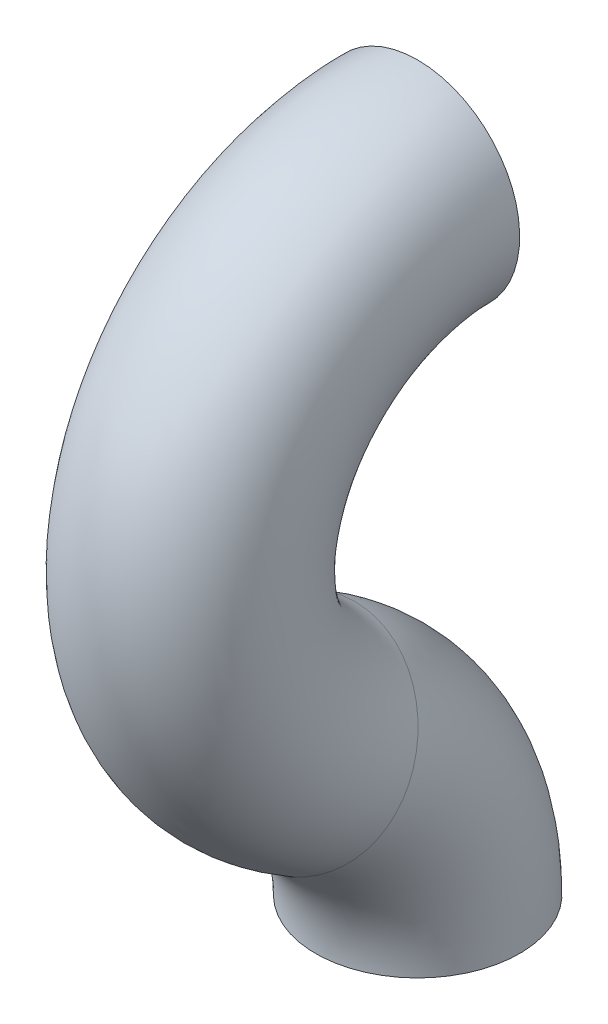
ISO-10303-21;
HEADER;
FILE_DESCRIPTION(('STEP AP214'),'2;1');
FILE_NAME('part.step','',(''),(''),'','','');
FILE_SCHEMA(('AUTOMOTIVE_DESIGN { 1 0 10303 214 1 1 1 1 }'));
ENDSEC;
DATA;
#1=APPLICATION_CONTEXT('core data for automotive mechanical design processes');
#2=APPLICATION_PROTOCOL_DEFINITION('international standard','automotive_design',2000,#1);
#3=PRODUCT_CONTEXT('',#1,'mechanical');
#4=PRODUCT('Part','Part','',(#3));
#5=PRODUCT_RELATED_PRODUCT_CATEGORY('part','',(#4));
#6=PRODUCT_DEFINITION_FORMATION('','',#4);
#7=PRODUCT_DEFINITION_CONTEXT('part definition',#1,'design');
#8=PRODUCT_DEFINITION('design','',#6,#7);
#9=PRODUCT_DEFINITION_SHAPE('','',#8);
#10=(LENGTH_UNIT() NAMED_UNIT(*) SI_UNIT(.MILLI.,.METRE.));
#11=(NAMED_UNIT(*) PLANE_ANGLE_UNIT() SI_UNIT($,.RADIAN.));
#12=(NAMED_UNIT(*) SI_UNIT($,.STERADIAN.) SOLID_ANGLE_UNIT());
#13=UNCERTAINTY_MEASURE_WITH_UNIT(LENGTH_MEASURE(1.E-05),#10,'distance_accuracy_value','');
#14=(GEOMETRIC_REPRESENTATION_CONTEXT(3) GLOBAL_UNCERTAINTY_ASSIGNED_CONTEXT((#13)) GLOBAL_UNIT_ASSIGNED_CONTEXT((#10,
#11,#12)) REPRESENTATION_CONTEXT('',''));
#15=CARTESIAN_POINT('',(0.,0.,0.));
#16=DIRECTION('',(0.,0.,1.));
#17=DIRECTION('',(1.,0.,0.));
#18=AXIS2_PLACEMENT_3D('',#15,#16,#17);
#19=CARTESIAN_POINT('',(0.,0.,0.));
#20=DIRECTION('',(0.,1.,0.));
#21=DIRECTION('',(0.,0.,1.));
#22=AXIS2_PLACEMENT_3D('',#19,#20,#21);
#23=PLANE('',#22);
#24=CARTESIAN_POINT('',(0.,0.,0.));
#25=DIRECTION('',(0.,1.,0.));
#26=DIRECTION('',(0.,0.,1.));
#27=AXIS2_PLACEMENT_3D('',#24,#25,#26);
#28=CIRCLE('',#27,23.);
#29=CARTESIAN_POINT('',(0.,0.,-23.));
#30=VERTEX_POINT('',#29);
#31=EDGE_CURVE('E49',#30,#30,#28,.T.);
#32=ORIENTED_EDGE('',*,*,#31,.F.);
#33=EDGE_LOOP('',(#32));
#34=FACE_BOUND('',#33,.T.);
#35=ADVANCED_FACE('F37',(#34),#23,.F.);
#36=CARTESIAN_POINT('',(0.,140.,0.));
#37=DIRECTION('',(0.,0.,-1.));
#38=DIRECTION('',(0.,1.,0.));
#39=AXIS2_PLACEMENT_3D('',#36,#37,#38);
#40=PLANE('',#39);
#41=CARTESIAN_POINT('',(0.,140.,0.));
#42=DIRECTION('',(0.,0.,-1.));
#43=DIRECTION('',(0.,1.,0.));
#44=AXIS2_PLACEMENT_3D('',#41,#42,#43);
#45=CIRCLE('',#44,23.);
#46=CARTESIAN_POINT('',(0.,163.,0.));
#47=VERTEX_POINT('',#46);
#48=EDGE_CURVE('E10',#47,#47,#45,.T.);
#49=ORIENTED_EDGE('',*,*,#48,.T.);
#50=EDGE_LOOP('',(#49));
#51=FACE_BOUND('',#50,.T.);
#52=ADVANCED_FACE('F60',(#51),#40,.T.);
#53=CARTESIAN_POINT('',(0.,0.,51.2435565298214));
#54=DIRECTION('',(1.,0.,0.));
#55=DIRECTION('',(0.,0.,-1.));
#56=AXIS2_PLACEMENT_3D('',#53,#54,#55);
#57=TOROIDAL_SURFACE('',#56,51.2435565298214,23.);
#58=CARTESIAN_POINT('',(0.,44.3782217350893,25.6217782649107));
#59=DIRECTION('',(0.,0.5,0.866025403784439));
#60=DIRECTION('',(0.,-0.866025403784439,0.5));
#61=AXIS2_PLACEMENT_3D('',#58,#59,#60);
#62=CIRCLE('',#61,23.);
#63=CARTESIAN_POINT('',(0.,64.2968060221314,14.1217782649107));
#64=VERTEX_POINT('',#63);
#65=EDGE_CURVE('E44',#64,#64,#62,.T.);
#66=CARTESIAN_POINT('',(0.,0.,51.2435565298214));
#67=DIRECTION('',(1.,0.,0.));
#68=DIRECTION('',(0.,0.,-1.));
#69=AXIS2_PLACEMENT_3D('',#66,#67,#68);
#70=CIRCLE('',#69,74.2435565298214);
#71=EDGE_CURVE('',#30,#64,#70,.T.);
#72=ORIENTED_EDGE('',*,*,#31,.T.);
#73=ORIENTED_EDGE('',*,*,#65,.F.);
#74=ORIENTED_EDGE('',*,*,#71,.T.);
#75=ORIENTED_EDGE('',*,*,#71,.F.);
#76=EDGE_LOOP('',(#72,#74,#73,#75));
#77=FACE_BOUND('',#76,.T.);
#78=ADVANCED_FACE('F57',(#77),#57,.T.);
#79=CARTESIAN_POINT('',(0.,88.7564434701786,0.));
#80=DIRECTION('',(-1.,0.,0.));
#81=DIRECTION('',(0.,0.,1.));
#82=AXIS2_PLACEMENT_3D('',#79,#80,#81);
#83=TOROIDAL_SURFACE('',#82,51.2435565298214,23.);
#84=ORIENTED_EDGE('',*,*,#48,.F.);
#85=EDGE_LOOP('',(#84));
#86=FACE_BOUND('',#85,.T.);
#87=ORIENTED_EDGE('',*,*,#65,.T.);
#88=EDGE_LOOP('',(#87));
#89=FACE_BOUND('',#88,.T.);
#90=ADVANCED_FACE('F64',(#86,#89),#83,.T.);
#91=CLOSED_SHELL('',(#35,#52,#78,#90));
#92=MANIFOLD_SOLID_BREP('B2',#91);
#93=ADVANCED_BREP_SHAPE_REPRESENTATION('',(#18,#92),#14);
#94=SHAPE_DEFINITION_REPRESENTATION(#9,#93);
ENDSEC;
END-ISO-10303-21;
